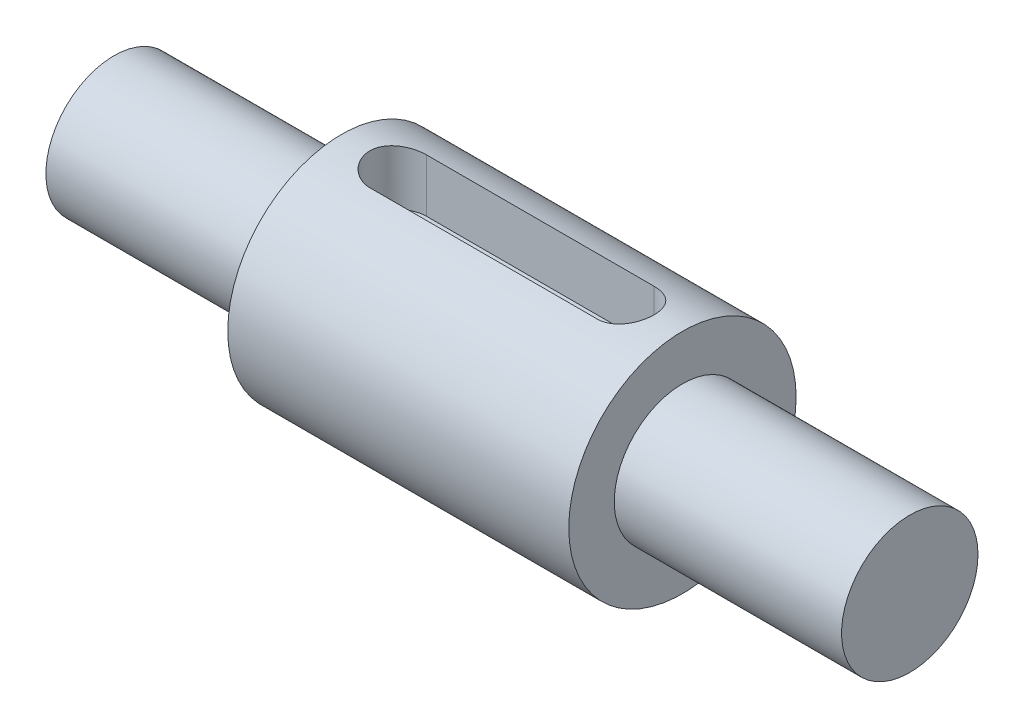
ISO-10303-21;
HEADER;
FILE_DESCRIPTION(('STEP AP214'),'2;1');
FILE_NAME('part.step','',(''),(''),'','','');
FILE_SCHEMA(('AUTOMOTIVE_DESIGN { 1 0 10303 214 1 1 1 1 }'));
ENDSEC;
DATA;
#1=APPLICATION_CONTEXT('core data for automotive mechanical design processes');
#2=APPLICATION_PROTOCOL_DEFINITION('international standard','automotive_design',2000,#1);
#3=PRODUCT_CONTEXT('',#1,'mechanical');
#4=PRODUCT('Part','Part','',(#3));
#5=PRODUCT_RELATED_PRODUCT_CATEGORY('part','',(#4));
#6=PRODUCT_DEFINITION_FORMATION('','',#4);
#7=PRODUCT_DEFINITION_CONTEXT('part definition',#1,'design');
#8=PRODUCT_DEFINITION('design','',#6,#7);
#9=PRODUCT_DEFINITION_SHAPE('','',#8);
#10=(LENGTH_UNIT() NAMED_UNIT(*) SI_UNIT(.MILLI.,.METRE.));
#11=(NAMED_UNIT(*) PLANE_ANGLE_UNIT() SI_UNIT($,.RADIAN.));
#12=(NAMED_UNIT(*) SI_UNIT($,.STERADIAN.) SOLID_ANGLE_UNIT());
#13=UNCERTAINTY_MEASURE_WITH_UNIT(LENGTH_MEASURE(1.E-05),#10,'distance_accuracy_value','');
#14=(GEOMETRIC_REPRESENTATION_CONTEXT(3) GLOBAL_UNCERTAINTY_ASSIGNED_CONTEXT((#13)) GLOBAL_UNIT_ASSIGNED_CONTEXT((#10,
#11,#12)) REPRESENTATION_CONTEXT('',''));
#15=CARTESIAN_POINT('',(0.,0.,0.));
#16=DIRECTION('',(0.,0.,1.));
#17=DIRECTION('',(1.,0.,0.));
#18=AXIS2_PLACEMENT_3D('',#15,#16,#17);
#19=CARTESIAN_POINT('',(500.,0.,0.));
#20=DIRECTION('',(-1.,0.,0.));
#21=DIRECTION('',(0.,0.,1.));
#22=AXIS2_PLACEMENT_3D('',#19,#20,#21);
#23=CYLINDRICAL_SURFACE('',#22,100.);
#24=CARTESIAN_POINT('',(200.,0.,0.));
#25=DIRECTION('',(1.,0.,0.));
#26=DIRECTION('',(0.,0.,-1.));
#27=AXIS2_PLACEMENT_3D('',#24,#25,#26);
#28=CIRCLE('',#27,100.);
#29=CARTESIAN_POINT('',(200.,0.,-100.));
#30=VERTEX_POINT('',#29);
#31=EDGE_CURVE('E125',#30,#30,#28,.T.);
#32=ORIENTED_EDGE('',*,*,#31,.T.);
#33=EDGE_LOOP('',(#32));
#34=FACE_BOUND('',#33,.T.);
#35=CARTESIAN_POINT('',(500.,0.,0.));
#36=DIRECTION('',(1.,0.,0.));
#37=DIRECTION('',(0.,0.,-1.));
#38=AXIS2_PLACEMENT_3D('',#35,#36,#37);
#39=CIRCLE('',#38,100.);
#40=CARTESIAN_POINT('',(500.,0.,-100.));
#41=VERTEX_POINT('',#40);
#42=EDGE_CURVE('E132',#41,#41,#39,.T.);
#43=ORIENTED_EDGE('',*,*,#42,.F.);
#44=EDGE_LOOP('',(#43));
#45=FACE_BOUND('',#44,.T.);
#46=CARTESIAN_POINT('',(250.,96.8245836551854,-25.));
#47=CARTESIAN_POINT('',(249.654293710868,96.8245806456344,-25.0000010832236));
#48=CARTESIAN_POINT('',(249.308627262302,96.8264357163775,-24.9928282718998));
#49=CARTESIAN_POINT('',(248.617938699469,96.8338315784694,-24.9641619425695));
#50=CARTESIAN_POINT('',(248.272916565843,96.8393722572249,-24.9426688620395));
#51=CARTESIAN_POINT('',(247.239895129539,96.8614715876696,-24.856771070407));
#52=CARTESIAN_POINT('',(246.553675709067,96.8835075787487,-24.770947764851));
#53=CARTESIAN_POINT('',(245.192633579943,96.9414738060922,-24.5431130232784));
#54=CARTESIAN_POINT('',(244.517791034619,96.9773765074594,-24.4012129251549));
#55=CARTESIAN_POINT('',(243.5167893588,97.0408207457143,-24.1471859120865));
#56=CARTESIAN_POINT('',(243.184980628744,97.0635687541502,-24.0556410600763));
#57=CARTESIAN_POINT('',(242.525545421166,97.1120967288656,-23.858980239019));
#58=CARTESIAN_POINT('',(242.197919982722,97.1378774327916,-23.753860967638));
#59=CARTESIAN_POINT('',(241.22249824424,97.2194688192118,-23.4185395528204));
#60=CARTESIAN_POINT('',(240.581832928432,97.2795495652073,-23.1682915928144));
#61=CARTESIAN_POINT('',(239.324101268641,97.4093599304015,-22.6162966384828));
#62=CARTESIAN_POINT('',(238.707035481557,97.479089777119,-22.3145484297796));
#63=CARTESIAN_POINT('',(237.802154232642,97.5894339316961,-21.8249931021924));
#64=CARTESIAN_POINT('',(237.503898530242,97.6271850528402,-21.6555992854606));
#65=CARTESIAN_POINT('',(236.914838681086,97.7043305964672,-21.3048359328003));
#66=CARTESIAN_POINT('',(236.624032643687,97.7437245952006,-21.1234694780403));
#67=CARTESIAN_POINT('',(235.76331571427,97.8639900209437,-20.5617635671005));
#68=CARTESIAN_POINT('',(235.205062798821,97.9469502063826,-20.1637941754056));
#69=CARTESIAN_POINT('',(234.112819248203,98.1178152255204,-19.3154133326393));
#70=CARTESIAN_POINT('',(233.579523311602,98.2057852756436,-18.8641231579431));
#71=CARTESIAN_POINT('',(232.552613004816,98.3826991035084,-17.9185875837739));
#72=CARTESIAN_POINT('',(232.058999176735,98.4716428945337,-17.4243415976656));
#73=CARTESIAN_POINT('',(231.114653332595,98.6480665960783,-16.3960683722489));
#74=CARTESIAN_POINT('',(230.663928039727,98.7355462753183,-15.8620349191884));
#75=CARTESIAN_POINT('',(229.808480311549,98.9066316664094,-14.7577217495324));
#76=CARTESIAN_POINT('',(229.403758060597,98.9902373627345,-14.1874418876929));
#77=CARTESIAN_POINT('',(228.637826031149,99.1524098307049,-13.006149810374));
#78=CARTESIAN_POINT('',(228.277303816993,99.2308897966055,-12.3946795395822));
#79=CARTESIAN_POINT('',(227.609175851288,99.3792878783004,-11.1424682048431));
#80=CARTESIAN_POINT('',(227.301570748301,99.4492058891548,-10.5017267822652));
#81=CARTESIAN_POINT('',(226.741749007166,99.5784717334308,-9.19557102551974));
#82=CARTESIAN_POINT('',(226.489523322857,99.6378212928959,-8.53016074176754));
#83=CARTESIAN_POINT('',(226.042481608942,99.7442505084538,-7.17937280340171));
#84=CARTESIAN_POINT('',(225.847664241848,99.7913304503989,-6.49399561438231));
#85=CARTESIAN_POINT('',(225.520454075065,99.8710343201552,-5.12238468992914));
#86=CARTESIAN_POINT('',(225.386877433979,99.9039315916681,-4.43644915357242));
#87=CARTESIAN_POINT('',(225.177569099849,99.955704019197,-3.05528318906929));
#88=CARTESIAN_POINT('',(225.101836703257,99.9745793457593,-2.3600528740782));
#89=CARTESIAN_POINT('',(225.008880466089,99.99777009632,-0.965523564462978));
#90=CARTESIAN_POINT('',(224.9916503918,100.002087071583,-0.266225011284586));
#91=CARTESIAN_POINT('',(225.015833523646,99.9960420808285,1.13128890256805));
#92=CARTESIAN_POINT('',(225.057246001735,99.9856802970479,1.82950427658219));
#93=CARTESIAN_POINT('',(225.196776939498,99.9509652417186,3.20418287639005));
#94=CARTESIAN_POINT('',(225.293614283502,99.926928140407,3.88078460113855));
#95=CARTESIAN_POINT('',(225.542198269069,99.8657577301367,5.22320752508532));
#96=CARTESIAN_POINT('',(225.69394395814,99.8286246483535,5.8890289110801));
#97=CARTESIAN_POINT('',(226.051126931784,99.7422604616705,7.20531401210698));
#98=CARTESIAN_POINT('',(226.256565508745,99.6930290655662,7.85577735706042));
#99=CARTESIAN_POINT('',(226.719536269367,99.5837809349568,9.1369562669927));
#100=CARTESIAN_POINT('',(226.977069190468,99.5237640477754,9.76767155227524));
#101=CARTESIAN_POINT('',(227.544861211466,99.3939445877628,11.0108082637533));
#102=CARTESIAN_POINT('',(227.855575583771,99.3240585160599,11.6230129719154));
#103=CARTESIAN_POINT('',(228.525829388481,99.1767773315422,12.8191262103548));
#104=CARTESIAN_POINT('',(228.885368995638,99.0993821918517,13.4030346393459));
#105=CARTESIAN_POINT('',(229.650825636036,98.9391169851476,14.5389202741498));
#106=CARTESIAN_POINT('',(230.056748347613,98.8562462483227,15.0908935578968));
#107=CARTESIAN_POINT('',(230.912234237842,98.6872181346261,16.1593813142745));
#108=CARTESIAN_POINT('',(231.36179816226,98.6010607016049,16.6758951806984));
#109=CARTESIAN_POINT('',(232.314361392557,98.4253873523042,17.6836588757551));
#110=CARTESIAN_POINT('',(232.818475185522,98.3358435419896,18.1738510136241));
#111=CARTESIAN_POINT('',(233.866338267689,98.1581809337007,19.110171641577));
#112=CARTESIAN_POINT('',(234.410088557247,98.0700621717609,19.5562990188738));
#113=CARTESIAN_POINT('',(235.533805513465,97.8977145262736,20.4015599879116));
#114=CARTESIAN_POINT('',(236.113782683132,97.81348678325,20.8006798534074));
#115=CARTESIAN_POINT('',(237.305956675373,97.6513700472673,21.5489334179221));
#116=CARTESIAN_POINT('',(237.918152477929,97.573480853833,21.898068698115));
#117=CARTESIAN_POINT('',(239.17403723109,97.4259236634341,22.5455162365906));
#118=CARTESIAN_POINT('',(239.817877781413,97.3563021095828,22.8435452108076));
#119=CARTESIAN_POINT('',(241.129578712124,97.2278684030286,23.3841584519914));
#120=CARTESIAN_POINT('',(241.797441929779,97.169057532198,23.6267361446755));
#121=CARTESIAN_POINT('',(243.15142085191,97.0641443943371,24.054111889455));
#122=CARTESIAN_POINT('',(243.837511719973,97.018025718395,24.2389845864892));
#123=CARTESIAN_POINT('',(245.223430860526,96.9398639823849,24.54971311029));
#124=CARTESIAN_POINT('',(245.923252536664,96.9078143284648,24.6755965859243));
#125=CARTESIAN_POINT('',(247.186287369856,96.8638484492838,24.8475598074561));
#126=CARTESIAN_POINT('',(247.74791906534,96.8491436484458,24.9047417612488));
#127=CARTESIAN_POINT('',(248.873018143064,96.8295027476483,24.9809469098807));
#128=CARTESIAN_POINT('',(249.436481070793,96.8245508430344,25.0000318419608));
#129=CARTESIAN_POINT('',(250.,96.8245836551854,25.));
#130=B_SPLINE_CURVE_WITH_KNOTS('',3,(#46,#47,#48,#49,#50,#51,#52,#53,#54,#55,#56,#57,#58,#59,
#60,#61,#62,#63,#64,#65,#66,#67,#68,#69,#70,#71,#72,#73,#74,#75,#76,#77,#78,#79,#80,#81,#82,#83,
#84,#85,#86,#87,#88,#89,#90,#91,#92,#93,#94,#95,#96,#97,#98,#99,#100,#101,#102,#103,#104,#105,
#106,#107,#108,#109,#110,#111,#112,#113,#114,#115,#116,#117,#118,#119,#120,#121,#122,#123,#124,
#125,#126,#127,#128,#129),.UNSPECIFIED.,.F.,.F.,(4,2,2,2,2,2,2,2,2,2,2,2,2,2,2,2,2,2,2,2,2,2,2,
2,2,2,2,2,2,2,2,2,2,2,2,2,2,2,2,2,2,4),(0.,1.03696016689963,2.07388865666906,4.14695305031536,
6.21592198395765,7.25052399877411,8.28537818354144,10.3540862308852,12.4228430651738,
13.4578078210555,14.4925072584998,16.5617583300267,18.6717771936341,20.7818248776966,
22.8922027890773,25.0025891575468,27.1424849203211,29.2824069081713,31.42197908192,
33.5615014043592,35.6577128681694,37.7538988357438,39.8498614372831,41.9457980177365,
43.9951391795801,46.0444447933455,48.0937997383924,50.1431836958064,52.2110801757666,
54.2789840571817,56.3471413682705,58.4153340273414,60.5393298734117,62.6633793439905,
64.7880475096761,66.912648450381,69.0486700393333,71.1849447429869,73.3184444814344,
75.4509432234355,77.1437935192076,78.833898271571),.UNSPECIFIED.);
#131=CARTESIAN_POINT('',(250.,96.8245836551854,-25.));
#132=VERTEX_POINT('',#131);
#133=CARTESIAN_POINT('',(250.,96.8245836551854,25.));
#134=VERTEX_POINT('',#133);
#135=EDGE_CURVE('E11',#132,#134,#130,.T.);
#136=ORIENTED_EDGE('',*,*,#135,.F.);
#137=DIRECTION('',(-1.,0.,0.));
#138=VECTOR('',#137,1.);
#139=CARTESIAN_POINT('',(500.,96.8245836551854,-25.));
#140=LINE('',#139,#138);
#141=CARTESIAN_POINT('',(450.,96.8245836551854,-25.));
#142=VERTEX_POINT('',#141);
#143=EDGE_CURVE('E130',#142,#132,#140,.T.);
#144=ORIENTED_EDGE('',*,*,#143,.F.);
#145=CARTESIAN_POINT('',(450.,96.8245836551854,25.));
#146=CARTESIAN_POINT('',(450.345706289132,96.8245806456344,25.0000010832236));
#147=CARTESIAN_POINT('',(450.691372737698,96.8264357163775,24.9928282718998));
#148=CARTESIAN_POINT('',(451.382061300531,96.8338315784694,24.9641619425695));
#149=CARTESIAN_POINT('',(451.727083434157,96.8393722572249,24.9426688620395));
#150=CARTESIAN_POINT('',(452.760104870461,96.8614715876696,24.856771070407));
#151=CARTESIAN_POINT('',(453.446324290933,96.8835075787487,24.770947764851));
#152=CARTESIAN_POINT('',(454.807366420057,96.9414738060922,24.5431130232784));
#153=CARTESIAN_POINT('',(455.482208965381,96.9773765074594,24.4012129251549));
#154=CARTESIAN_POINT('',(456.4832106412,97.0408207457143,24.1471859120865));
#155=CARTESIAN_POINT('',(456.815019371256,97.0635687541502,24.0556410600763));
#156=CARTESIAN_POINT('',(457.474454578834,97.1120967288656,23.858980239019));
#157=CARTESIAN_POINT('',(457.802080017278,97.1378774327916,23.753860967638));
#158=CARTESIAN_POINT('',(458.77750175576,97.2194688192118,23.4185395528204));
#159=CARTESIAN_POINT('',(459.418167071568,97.2795495652073,23.1682915928144));
#160=CARTESIAN_POINT('',(460.675898731359,97.4093599304015,22.6162966384828));
#161=CARTESIAN_POINT('',(461.292964518443,97.479089777119,22.3145484297796));
#162=CARTESIAN_POINT('',(462.197845767358,97.5894339316961,21.8249931021924));
#163=CARTESIAN_POINT('',(462.496101469758,97.6271850528402,21.6555992854605));
#164=CARTESIAN_POINT('',(463.085161318914,97.7043305964672,21.3048359328003));
#165=CARTESIAN_POINT('',(463.375967356313,97.7437245952006,21.1234694780402));
#166=CARTESIAN_POINT('',(464.23668428573,97.8639900209437,20.5617635671004));
#167=CARTESIAN_POINT('',(464.794937201179,97.9469502063826,20.1637941754056));
#168=CARTESIAN_POINT('',(465.887180751797,98.1178152255204,19.3154133326392));
#169=CARTESIAN_POINT('',(466.420476688398,98.2057852756436,18.8641231579431));
#170=CARTESIAN_POINT('',(467.447386995184,98.3826991035084,17.9185875837739));
#171=CARTESIAN_POINT('',(467.941000823265,98.4716428945337,17.4243415976656));
#172=CARTESIAN_POINT('',(468.885346667405,98.6480665960783,16.3960683722489));
#173=CARTESIAN_POINT('',(469.336071960273,98.7355462753183,15.8620349191884));
#174=CARTESIAN_POINT('',(470.191519688451,98.9066316664094,14.7577217495324));
#175=CARTESIAN_POINT('',(470.596241939403,98.9902373627345,14.1874418876929));
#176=CARTESIAN_POINT('',(471.362173968851,99.1524098307049,13.006149810374));
#177=CARTESIAN_POINT('',(471.722696183007,99.2308897966055,12.3946795395822));
#178=CARTESIAN_POINT('',(472.390824148712,99.3792878783004,11.1424682048431));
#179=CARTESIAN_POINT('',(472.698429251698,99.4492058891549,10.5017267822651));
#180=CARTESIAN_POINT('',(473.258250992834,99.5784717334308,9.19557102551971));
#181=CARTESIAN_POINT('',(473.510476677143,99.6378212928959,8.53016074176752));
#182=CARTESIAN_POINT('',(473.957518391058,99.7442505084537,7.17937280340169));
#183=CARTESIAN_POINT('',(474.152335758152,99.7913304503989,6.4939956143823));
#184=CARTESIAN_POINT('',(474.479545924935,99.8710343201552,5.12238468992913));
#185=CARTESIAN_POINT('',(474.613122566021,99.9039315916681,4.4364491535724));
#186=CARTESIAN_POINT('',(474.822430900151,99.955704019197,3.05528318906927));
#187=CARTESIAN_POINT('',(474.898163296743,99.9745793457593,2.36005287407819));
#188=CARTESIAN_POINT('',(474.991119533911,99.99777009632,0.96552356446297));
#189=CARTESIAN_POINT('',(475.0083496082,100.002087071583,0.266225011284576));
#190=CARTESIAN_POINT('',(474.984166476354,99.9960420808285,-1.13128890256806));
#191=CARTESIAN_POINT('',(474.942753998265,99.9856802970479,-1.8295042765822));
#192=CARTESIAN_POINT('',(474.803223060502,99.9509652417186,-3.20418287639005));
#193=CARTESIAN_POINT('',(474.706385716498,99.926928140407,-3.88078460113855));
#194=CARTESIAN_POINT('',(474.457801730931,99.8657577301367,-5.22320752508532));
#195=CARTESIAN_POINT('',(474.30605604186,99.8286246483535,-5.8890289110801));
#196=CARTESIAN_POINT('',(473.948873068216,99.7422604616705,-7.20531401210698));
#197=CARTESIAN_POINT('',(473.743434491255,99.6930290655662,-7.85577735706042));
#198=CARTESIAN_POINT('',(473.280463730633,99.5837809349568,-9.1369562669927));
#199=CARTESIAN_POINT('',(473.022930809532,99.5237640477754,-9.76767155227524));
#200=CARTESIAN_POINT('',(472.455138788534,99.3939445877628,-11.0108082637533));
#201=CARTESIAN_POINT('',(472.144424416229,99.3240585160599,-11.6230129719155));
#202=CARTESIAN_POINT('',(471.474170611519,99.1767773315422,-12.8191262103548));
#203=CARTESIAN_POINT('',(471.114631004362,99.0993821918517,-13.4030346393459));
#204=CARTESIAN_POINT('',(470.349174363964,98.9391169851476,-14.5389202741498));
#205=CARTESIAN_POINT('',(469.943251652387,98.8562462483227,-15.0908935578968));
#206=CARTESIAN_POINT('',(469.087765762158,98.6872181346261,-16.1593813142745));
#207=CARTESIAN_POINT('',(468.63820183774,98.6010607016049,-16.6758951806984));
#208=CARTESIAN_POINT('',(467.685638607443,98.4253873523042,-17.6836588757551));
#209=CARTESIAN_POINT('',(467.181524814478,98.3358435419896,-18.173851013624));
#210=CARTESIAN_POINT('',(466.133661732311,98.1581809337007,-19.110171641577));
#211=CARTESIAN_POINT('',(465.589911442753,98.0700621717609,-19.5562990188738));
#212=CARTESIAN_POINT('',(464.466194486535,97.8977145262736,-20.4015599879116));
#213=CARTESIAN_POINT('',(463.886217316868,97.81348678325,-20.8006798534074));
#214=CARTESIAN_POINT('',(462.694043324627,97.6513700472673,-21.5489334179221));
#215=CARTESIAN_POINT('',(462.081847522071,97.573480853833,-21.898068698115));
#216=CARTESIAN_POINT('',(460.82596276891,97.4259236634341,-22.5455162365906));
#217=CARTESIAN_POINT('',(460.182122218587,97.3563021095828,-22.8435452108076));
#218=CARTESIAN_POINT('',(458.870421287876,97.2278684030287,-23.3841584519914));
#219=CARTESIAN_POINT('',(458.202558070221,97.169057532198,-23.6267361446755));
#220=CARTESIAN_POINT('',(456.84857914809,97.064144394337,-24.0541118894549));
#221=CARTESIAN_POINT('',(456.162488280027,97.018025718395,-24.2389845864892));
#222=CARTESIAN_POINT('',(454.776569139474,96.9398639823849,-24.54971311029));
#223=CARTESIAN_POINT('',(454.076747463336,96.9078143284648,-24.6755965859243));
#224=CARTESIAN_POINT('',(452.813712630144,96.8638484492838,-24.8475598074562));
#225=CARTESIAN_POINT('',(452.25208093466,96.8491436484458,-24.9047417612488));
#226=CARTESIAN_POINT('',(451.126981856936,96.8295027476483,-24.9809469098807));
#227=CARTESIAN_POINT('',(450.563518929207,96.8245508430344,-25.0000318419609));
#228=CARTESIAN_POINT('',(450.,96.8245836551854,-25.));
#229=B_SPLINE_CURVE_WITH_KNOTS('',3,(#145,#146,#147,#148,#149,#150,#151,#152,#153,#154,#155,
#156,#157,#158,#159,#160,#161,#162,#163,#164,#165,#166,#167,#168,#169,#170,#171,#172,#173,#174,
#175,#176,#177,#178,#179,#180,#181,#182,#183,#184,#185,#186,#187,#188,#189,#190,#191,#192,#193,
#194,#195,#196,#197,#198,#199,#200,#201,#202,#203,#204,#205,#206,#207,#208,#209,#210,#211,#212,
#213,#214,#215,#216,#217,#218,#219,#220,#221,#222,#223,#224,#225,#226,#227,#228),.UNSPECIFIED.,
.F.,.F.,(4,2,2,2,2,2,2,2,2,2,2,2,2,2,2,2,2,2,2,2,2,2,2,2,2,2,2,2,2,2,2,2,2,2,2,2,2,2,2,2,2,4),
(0.,1.03696016689961,2.073888656669,4.14695305031533,6.21592198395762,7.25052399877411,
8.28537818354141,10.3540862308852,12.4228430651738,13.4578078210554,14.4925072584998,
16.5617583300267,18.6717771936341,20.7818248776966,22.8922027890774,25.0025891575468,
27.1424849203211,29.2824069081713,31.42197908192,33.5615014043592,35.6577128681694,
37.7538988357438,39.8498614372831,41.9457980177365,43.9951391795801,46.0444447933454,
48.0937997383924,50.1431836958063,52.2110801757665,54.2789840571817,56.3471413682705,
58.4153340273413,60.5393298734116,62.6633793439905,64.7880475096761,66.9126484503809,
69.0486700393332,71.1849447429867,73.3184444814343,75.4509432234355,77.1437935192076,
78.833898271571),.UNSPECIFIED.);
#230=CARTESIAN_POINT('',(450.,96.8245836551854,25.));
#231=VERTEX_POINT('',#230);
#232=EDGE_CURVE('E148',#231,#142,#229,.T.);
#233=ORIENTED_EDGE('',*,*,#232,.F.);
#234=DIRECTION('',(-1.,0.,0.));
#235=VECTOR('',#234,1.);
#236=CARTESIAN_POINT('',(500.,96.8245836551854,25.));
#237=LINE('',#236,#235);
#238=EDGE_CURVE('E54',#134,#231,#237,.F.);
#239=ORIENTED_EDGE('',*,*,#238,.F.);
#240=EDGE_LOOP('',(#136,#144,#233,#239));
#241=FACE_BOUND('',#240,.T.);
#242=ADVANCED_FACE('F39',(#34,#45,#241),#23,.T.);
#243=CARTESIAN_POINT('',(200.,0.,0.));
#244=DIRECTION('',(-1.,0.,0.));
#245=DIRECTION('',(0.,0.,1.));
#246=AXIS2_PLACEMENT_3D('',#243,#244,#245);
#247=CYLINDRICAL_SURFACE('',#246,60.);
#248=CARTESIAN_POINT('',(200.,0.,0.));
#249=DIRECTION('',(1.,0.,0.));
#250=DIRECTION('',(0.,0.,-1.));
#251=AXIS2_PLACEMENT_3D('',#248,#249,#250);
#252=CIRCLE('',#251,60.);
#253=CARTESIAN_POINT('',(200.,0.,-60.));
#254=VERTEX_POINT('',#253);
#255=EDGE_CURVE('E131',#254,#254,#252,.T.);
#256=ORIENTED_EDGE('',*,*,#255,.F.);
#257=EDGE_LOOP('',(#256));
#258=FACE_BOUND('',#257,.T.);
#259=CARTESIAN_POINT('',(0.,0.,0.));
#260=DIRECTION('',(1.,0.,0.));
#261=DIRECTION('',(0.,0.,-1.));
#262=AXIS2_PLACEMENT_3D('',#259,#260,#261);
#263=CIRCLE('',#262,60.);
#264=CARTESIAN_POINT('',(0.,0.,-60.));
#265=VERTEX_POINT('',#264);
#266=EDGE_CURVE('E136',#265,#265,#263,.T.);
#267=ORIENTED_EDGE('',*,*,#266,.T.);
#268=EDGE_LOOP('',(#267));
#269=FACE_BOUND('',#268,.T.);
#270=ADVANCED_FACE('F41',(#258,#269),#247,.T.);
#271=CARTESIAN_POINT('',(0.,0.,0.));
#272=DIRECTION('',(1.,0.,0.));
#273=DIRECTION('',(0.,0.,-1.));
#274=AXIS2_PLACEMENT_3D('',#271,#272,#273);
#275=PLANE('',#274);
#276=ORIENTED_EDGE('',*,*,#266,.F.);
#277=EDGE_LOOP('',(#276));
#278=FACE_BOUND('',#277,.T.);
#279=ADVANCED_FACE('F180',(#278),#275,.F.);
#280=CARTESIAN_POINT('',(500.,0.,0.));
#281=DIRECTION('',(1.,0.,0.));
#282=DIRECTION('',(0.,0.,-1.));
#283=AXIS2_PLACEMENT_3D('',#280,#281,#282);
#284=PLANE('',#283);
#285=CARTESIAN_POINT('',(500.,0.,0.));
#286=DIRECTION('',(1.,0.,0.));
#287=DIRECTION('',(0.,0.,-1.));
#288=AXIS2_PLACEMENT_3D('',#285,#286,#287);
#289=CIRCLE('',#288,60.);
#290=CARTESIAN_POINT('',(500.,0.,-60.));
#291=VERTEX_POINT('',#290);
#292=EDGE_CURVE('E126',#291,#291,#289,.T.);
#293=ORIENTED_EDGE('',*,*,#292,.F.);
#294=EDGE_LOOP('',(#293));
#295=FACE_BOUND('',#294,.T.);
#296=ORIENTED_EDGE('',*,*,#42,.T.);
#297=EDGE_LOOP('',(#296));
#298=FACE_BOUND('',#297,.T.);
#299=ADVANCED_FACE('F178',(#295,#298),#284,.T.);
#300=CARTESIAN_POINT('',(200.,0.,0.));
#301=DIRECTION('',(1.,0.,0.));
#302=DIRECTION('',(0.,0.,-1.));
#303=AXIS2_PLACEMENT_3D('',#300,#301,#302);
#304=PLANE('',#303);
#305=ORIENTED_EDGE('',*,*,#255,.T.);
#306=EDGE_LOOP('',(#305));
#307=FACE_BOUND('',#306,.T.);
#308=ORIENTED_EDGE('',*,*,#31,.F.);
#309=EDGE_LOOP('',(#308));
#310=FACE_BOUND('',#309,.T.);
#311=ADVANCED_FACE('F176',(#307,#310),#304,.F.);
#312=CARTESIAN_POINT('',(700.,0.,0.));
#313=DIRECTION('',(-1.,0.,0.));
#314=DIRECTION('',(0.,0.,1.));
#315=AXIS2_PLACEMENT_3D('',#312,#313,#314);
#316=CYLINDRICAL_SURFACE('',#315,60.);
#317=CARTESIAN_POINT('',(700.,0.,0.));
#318=DIRECTION('',(1.,0.,0.));
#319=DIRECTION('',(0.,0.,-1.));
#320=AXIS2_PLACEMENT_3D('',#317,#318,#319);
#321=CIRCLE('',#320,60.);
#322=CARTESIAN_POINT('',(700.,0.,-60.));
#323=VERTEX_POINT('',#322);
#324=EDGE_CURVE('E92',#323,#323,#321,.T.);
#325=ORIENTED_EDGE('',*,*,#324,.F.);
#326=EDGE_LOOP('',(#325));
#327=FACE_BOUND('',#326,.T.);
#328=ORIENTED_EDGE('',*,*,#292,.T.);
#329=EDGE_LOOP('',(#328));
#330=FACE_BOUND('',#329,.T.);
#331=ADVANCED_FACE('F172',(#327,#330),#316,.T.);
#332=CARTESIAN_POINT('',(700.,0.,0.));
#333=DIRECTION('',(1.,0.,0.));
#334=DIRECTION('',(0.,0.,-1.));
#335=AXIS2_PLACEMENT_3D('',#332,#333,#334);
#336=PLANE('',#335);
#337=ORIENTED_EDGE('',*,*,#324,.T.);
#338=EDGE_LOOP('',(#337));
#339=FACE_BOUND('',#338,.T.);
#340=ADVANCED_FACE('F169',(#339),#336,.T.);
#341=CARTESIAN_POINT('',(250.,250.,0.));
#342=DIRECTION('',(0.,-1.,0.));
#343=DIRECTION('',(0.,0.,-1.));
#344=AXIS2_PLACEMENT_3D('',#341,#342,#343);
#345=CYLINDRICAL_SURFACE('',#344,25.);
#346=ORIENTED_EDGE('',*,*,#135,.T.);
#347=DIRECTION('',(0.,-1.,0.));
#348=VECTOR('',#347,1.);
#349=CARTESIAN_POINT('',(250.,250.,25.));
#350=LINE('',#349,#348);
#351=CARTESIAN_POINT('',(250.,50.,25.));
#352=VERTEX_POINT('',#351);
#353=EDGE_CURVE('E84',#134,#352,#350,.T.);
#354=ORIENTED_EDGE('',*,*,#353,.T.);
#355=CARTESIAN_POINT('',(250.,50.,0.));
#356=DIRECTION('',(0.,1.,0.));
#357=DIRECTION('',(0.,0.,1.));
#358=AXIS2_PLACEMENT_3D('',#355,#356,#357);
#359=CIRCLE('',#358,25.);
#360=CARTESIAN_POINT('',(250.,50.,-25.));
#361=VERTEX_POINT('',#360);
#362=EDGE_CURVE('E88',#361,#352,#359,.T.);
#363=ORIENTED_EDGE('',*,*,#362,.F.);
#364=DIRECTION('',(0.,-1.,0.));
#365=VECTOR('',#364,1.);
#366=CARTESIAN_POINT('',(250.,250.,-25.));
#367=LINE('',#366,#365);
#368=EDGE_CURVE('E115',#132,#361,#367,.T.);
#369=ORIENTED_EDGE('',*,*,#368,.F.);
#370=EDGE_LOOP('',(#346,#354,#363,#369));
#371=FACE_BOUND('',#370,.T.);
#372=ADVANCED_FACE('F86',(#371),#345,.F.);
#373=CARTESIAN_POINT('',(250.,250.,25.));
#374=DIRECTION('',(0.,0.,-1.));
#375=DIRECTION('',(-1.,0.,0.));
#376=AXIS2_PLACEMENT_3D('',#373,#374,#375);
#377=PLANE('',#376);
#378=ORIENTED_EDGE('',*,*,#238,.T.);
#379=DIRECTION('',(0.,-1.,0.));
#380=VECTOR('',#379,1.);
#381=CARTESIAN_POINT('',(450.,250.,25.));
#382=LINE('',#381,#380);
#383=CARTESIAN_POINT('',(450.,50.,25.));
#384=VERTEX_POINT('',#383);
#385=EDGE_CURVE('E93',#231,#384,#382,.T.);
#386=ORIENTED_EDGE('',*,*,#385,.T.);
#387=DIRECTION('',(1.,0.,0.));
#388=VECTOR('',#387,1.);
#389=CARTESIAN_POINT('',(250.,50.,25.));
#390=LINE('',#389,#388);
#391=EDGE_CURVE('E96',#352,#384,#390,.T.);
#392=ORIENTED_EDGE('',*,*,#391,.F.);
#393=ORIENTED_EDGE('',*,*,#353,.F.);
#394=EDGE_LOOP('',(#378,#386,#392,#393));
#395=FACE_BOUND('',#394,.T.);
#396=ADVANCED_FACE('F97',(#395),#377,.T.);
#397=CARTESIAN_POINT('',(450.,250.,0.));
#398=DIRECTION('',(0.,-1.,0.));
#399=DIRECTION('',(0.,0.,-1.));
#400=AXIS2_PLACEMENT_3D('',#397,#398,#399);
#401=CYLINDRICAL_SURFACE('',#400,25.);
#402=ORIENTED_EDGE('',*,*,#232,.T.);
#403=DIRECTION('',(0.,-1.,0.));
#404=VECTOR('',#403,1.);
#405=CARTESIAN_POINT('',(450.,250.,-25.));
#406=LINE('',#405,#404);
#407=CARTESIAN_POINT('',(450.,50.,-25.));
#408=VERTEX_POINT('',#407);
#409=EDGE_CURVE('E61',#142,#408,#406,.T.);
#410=ORIENTED_EDGE('',*,*,#409,.T.);
#411=CARTESIAN_POINT('',(450.,50.,0.));
#412=DIRECTION('',(0.,1.,0.));
#413=DIRECTION('',(0.,0.,1.));
#414=AXIS2_PLACEMENT_3D('',#411,#412,#413);
#415=CIRCLE('',#414,25.);
#416=EDGE_CURVE('E103',#384,#408,#415,.T.);
#417=ORIENTED_EDGE('',*,*,#416,.F.);
#418=ORIENTED_EDGE('',*,*,#385,.F.);
#419=EDGE_LOOP('',(#402,#410,#417,#418));
#420=FACE_BOUND('',#419,.T.);
#421=ADVANCED_FACE('F157',(#420),#401,.F.);
#422=CARTESIAN_POINT('',(250.,250.,-25.));
#423=DIRECTION('',(0.,0.,1.));
#424=DIRECTION('',(1.,0.,0.));
#425=AXIS2_PLACEMENT_3D('',#422,#423,#424);
#426=PLANE('',#425);
#427=ORIENTED_EDGE('',*,*,#143,.T.);
#428=ORIENTED_EDGE('',*,*,#368,.T.);
#429=DIRECTION('',(-1.,0.,0.));
#430=VECTOR('',#429,1.);
#431=CARTESIAN_POINT('',(250.,50.,-25.));
#432=LINE('',#431,#430);
#433=EDGE_CURVE('E107',#408,#361,#432,.T.);
#434=ORIENTED_EDGE('',*,*,#433,.F.);
#435=ORIENTED_EDGE('',*,*,#409,.F.);
#436=EDGE_LOOP('',(#427,#428,#434,#435));
#437=FACE_BOUND('',#436,.T.);
#438=ADVANCED_FACE('F162',(#437),#426,.T.);
#439=CARTESIAN_POINT('',(250.,50.,0.));
#440=DIRECTION('',(0.,1.,0.));
#441=DIRECTION('',(0.,0.,1.));
#442=AXIS2_PLACEMENT_3D('',#439,#440,#441);
#443=PLANE('',#442);
#444=ORIENTED_EDGE('',*,*,#362,.T.);
#445=ORIENTED_EDGE('',*,*,#391,.T.);
#446=ORIENTED_EDGE('',*,*,#416,.T.);
#447=ORIENTED_EDGE('',*,*,#433,.T.);
#448=EDGE_LOOP('',(#444,#445,#446,#447));
#449=FACE_BOUND('',#448,.T.);
#450=ADVANCED_FACE('F106',(#449),#443,.T.);
#451=CLOSED_SHELL('',(#242,#270,#279,#299,#311,#331,#340,#372,#396,#421,#438,#450));
#452=MANIFOLD_SOLID_BREP('B2',#451);
#453=ADVANCED_BREP_SHAPE_REPRESENTATION('',(#18,#452),#14);
#454=SHAPE_DEFINITION_REPRESENTATION(#9,#453);
ENDSEC;
END-ISO-10303-21;
